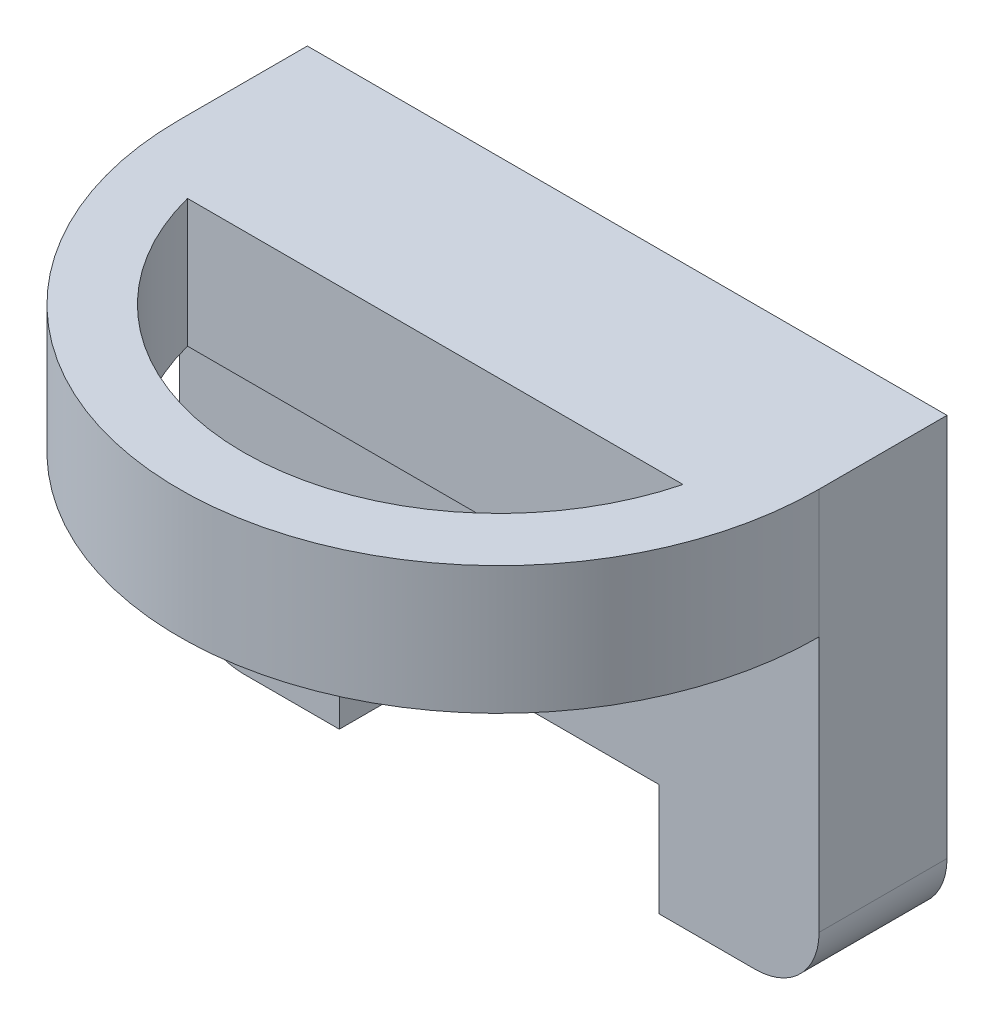
ISO-10303-21;
HEADER;
FILE_DESCRIPTION(('STEP AP214'),'2;1');
FILE_NAME('part.step','',(''),(''),'','','');
FILE_SCHEMA(('AUTOMOTIVE_DESIGN { 1 0 10303 214 1 1 1 1 }'));
ENDSEC;
DATA;
#1=APPLICATION_CONTEXT('core data for automotive mechanical design processes');
#2=APPLICATION_PROTOCOL_DEFINITION('international standard','automotive_design',2000,#1);
#3=PRODUCT_CONTEXT('',#1,'mechanical');
#4=PRODUCT('Part','Part','',(#3));
#5=PRODUCT_RELATED_PRODUCT_CATEGORY('part','',(#4));
#6=PRODUCT_DEFINITION_FORMATION('','',#4);
#7=PRODUCT_DEFINITION_CONTEXT('part definition',#1,'design');
#8=PRODUCT_DEFINITION('design','',#6,#7);
#9=PRODUCT_DEFINITION_SHAPE('','',#8);
#10=(LENGTH_UNIT() NAMED_UNIT(*) SI_UNIT(.MILLI.,.METRE.));
#11=(NAMED_UNIT(*) PLANE_ANGLE_UNIT() SI_UNIT($,.RADIAN.));
#12=(NAMED_UNIT(*) SI_UNIT($,.STERADIAN.) SOLID_ANGLE_UNIT());
#13=UNCERTAINTY_MEASURE_WITH_UNIT(LENGTH_MEASURE(1.E-05),#10,'distance_accuracy_value','');
#14=(GEOMETRIC_REPRESENTATION_CONTEXT(3) GLOBAL_UNCERTAINTY_ASSIGNED_CONTEXT((#13)) GLOBAL_UNIT_ASSIGNED_CONTEXT((#10,
#11,#12)) REPRESENTATION_CONTEXT('',''));
#15=CARTESIAN_POINT('',(0.,0.,0.));
#16=DIRECTION('',(0.,0.,1.));
#17=DIRECTION('',(1.,0.,0.));
#18=AXIS2_PLACEMENT_3D('',#15,#16,#17);
#19=CARTESIAN_POINT('',(-50.,35.,20.));
#20=DIRECTION('',(1.,0.,0.));
#21=DIRECTION('',(0.,1.,0.));
#22=AXIS2_PLACEMENT_3D('',#19,#20,#21);
#23=PLANE('',#22);
#24=DIRECTION('',(0.,-1.,0.));
#25=VECTOR('',#24,1.);
#26=CARTESIAN_POINT('',(-50.,35.,0.));
#27=LINE('',#26,#25);
#28=CARTESIAN_POINT('',(-50.,35.,0.));
#29=VERTEX_POINT('',#28);
#30=CARTESIAN_POINT('',(-50.,-24.9999999999999,0.));
#31=VERTEX_POINT('',#30);
#32=EDGE_CURVE('E161',#29,#31,#27,.T.);
#33=ORIENTED_EDGE('',*,*,#32,.T.);
#34=DIRECTION('',(0.,0.,-1.));
#35=VECTOR('',#34,1.);
#36=CARTESIAN_POINT('',(-50.,-24.9999999999999,20.));
#37=LINE('',#36,#35);
#38=CARTESIAN_POINT('',(-50.,-24.9999999999999,20.));
#39=VERTEX_POINT('',#38);
#40=EDGE_CURVE('E11',#39,#31,#37,.T.);
#41=ORIENTED_EDGE('',*,*,#40,.F.);
#42=DIRECTION('',(0.,-1.,0.));
#43=VECTOR('',#42,1.);
#44=CARTESIAN_POINT('',(-50.,35.,20.));
#45=LINE('',#44,#43);
#46=CARTESIAN_POINT('',(-50.,15.,20.));
#47=VERTEX_POINT('',#46);
#48=EDGE_CURVE('E166',#47,#39,#45,.T.);
#49=ORIENTED_EDGE('',*,*,#48,.F.);
#50=CARTESIAN_POINT('',(-50.,35.,20.));
#51=VERTEX_POINT('',#50);
#52=EDGE_CURVE('E162',#51,#47,#45,.T.);
#53=ORIENTED_EDGE('',*,*,#52,.F.);
#54=DIRECTION('',(0.,0.,-1.));
#55=VECTOR('',#54,1.);
#56=CARTESIAN_POINT('',(-50.,35.,20.));
#57=LINE('',#56,#55);
#58=EDGE_CURVE('E182',#51,#29,#57,.T.);
#59=ORIENTED_EDGE('',*,*,#58,.T.);
#60=EDGE_LOOP('',(#33,#41,#49,#53,#59));
#61=FACE_BOUND('',#60,.T.);
#62=ADVANCED_FACE('F33',(#61),#23,.F.);
#63=CARTESIAN_POINT('',(-40.,-25.,20.));
#64=DIRECTION('',(0.,0.,-1.));
#65=DIRECTION('',(-1.,0.,0.));
#66=AXIS2_PLACEMENT_3D('',#63,#64,#65);
#67=CYLINDRICAL_SURFACE('',#66,10.);
#68=CARTESIAN_POINT('',(-40.,-25.,0.));
#69=DIRECTION('',(0.,0.,1.));
#70=DIRECTION('',(1.,0.,0.));
#71=AXIS2_PLACEMENT_3D('',#68,#69,#70);
#72=CIRCLE('',#71,10.);
#73=CARTESIAN_POINT('',(-39.9999999999999,-35.,0.));
#74=VERTEX_POINT('',#73);
#75=EDGE_CURVE('E185',#31,#74,#72,.T.);
#76=ORIENTED_EDGE('',*,*,#75,.T.);
#77=DIRECTION('',(0.,0.,-1.));
#78=VECTOR('',#77,1.);
#79=CARTESIAN_POINT('',(-39.9999999999999,-35.,20.));
#80=LINE('',#79,#78);
#81=CARTESIAN_POINT('',(-39.9999999999999,-35.,20.));
#82=VERTEX_POINT('',#81);
#83=EDGE_CURVE('E40',#82,#74,#80,.T.);
#84=ORIENTED_EDGE('',*,*,#83,.F.);
#85=CARTESIAN_POINT('',(-40.,-25.,20.));
#86=DIRECTION('',(0.,0.,1.));
#87=DIRECTION('',(1.,0.,0.));
#88=AXIS2_PLACEMENT_3D('',#85,#86,#87);
#89=CIRCLE('',#88,10.);
#90=EDGE_CURVE('E165',#39,#82,#89,.T.);
#91=ORIENTED_EDGE('',*,*,#90,.F.);
#92=ORIENTED_EDGE('',*,*,#40,.T.);
#93=EDGE_LOOP('',(#76,#84,#91,#92));
#94=FACE_BOUND('',#93,.T.);
#95=ADVANCED_FACE('F252',(#94),#67,.T.);
#96=CARTESIAN_POINT('',(-39.9999999999999,-35.,20.));
#97=DIRECTION('',(0.,1.,0.));
#98=DIRECTION('',(0.,0.,1.));
#99=AXIS2_PLACEMENT_3D('',#96,#97,#98);
#100=PLANE('',#99);
#101=DIRECTION('',(1.,0.,0.));
#102=VECTOR('',#101,1.);
#103=CARTESIAN_POINT('',(-39.9999999999999,-35.,0.));
#104=LINE('',#103,#102);
#105=CARTESIAN_POINT('',(-25.,-35.,0.));
#106=VERTEX_POINT('',#105);
#107=EDGE_CURVE('E187',#74,#106,#104,.T.);
#108=ORIENTED_EDGE('',*,*,#107,.T.);
#109=DIRECTION('',(0.,0.,-1.));
#110=VECTOR('',#109,1.);
#111=CARTESIAN_POINT('',(-25.,-35.,20.));
#112=LINE('',#111,#110);
#113=CARTESIAN_POINT('',(-25.,-35.,20.));
#114=VERTEX_POINT('',#113);
#115=EDGE_CURVE('E223',#114,#106,#112,.T.);
#116=ORIENTED_EDGE('',*,*,#115,.F.);
#117=DIRECTION('',(1.,0.,0.));
#118=VECTOR('',#117,1.);
#119=CARTESIAN_POINT('',(-39.9999999999999,-35.,20.));
#120=LINE('',#119,#118);
#121=EDGE_CURVE('E168',#82,#114,#120,.T.);
#122=ORIENTED_EDGE('',*,*,#121,.F.);
#123=ORIENTED_EDGE('',*,*,#83,.T.);
#124=EDGE_LOOP('',(#108,#116,#122,#123));
#125=FACE_BOUND('',#124,.T.);
#126=ADVANCED_FACE('F230',(#125),#100,.F.);
#127=CARTESIAN_POINT('',(-25.,-35.,20.));
#128=DIRECTION('',(-1.,0.,0.));
#129=DIRECTION('',(0.,0.,1.));
#130=AXIS2_PLACEMENT_3D('',#127,#128,#129);
#131=PLANE('',#130);
#132=DIRECTION('',(0.,1.,0.));
#133=VECTOR('',#132,1.);
#134=CARTESIAN_POINT('',(-25.,-35.,0.));
#135=LINE('',#134,#133);
#136=CARTESIAN_POINT('',(-25.,-17.5,0.));
#137=VERTEX_POINT('',#136);
#138=EDGE_CURVE('E189',#106,#137,#135,.T.);
#139=ORIENTED_EDGE('',*,*,#138,.T.);
#140=DIRECTION('',(0.,0.,-1.));
#141=VECTOR('',#140,1.);
#142=CARTESIAN_POINT('',(-25.,-17.5,20.));
#143=LINE('',#142,#141);
#144=CARTESIAN_POINT('',(-25.,-17.5,20.));
#145=VERTEX_POINT('',#144);
#146=EDGE_CURVE('E220',#145,#137,#143,.T.);
#147=ORIENTED_EDGE('',*,*,#146,.F.);
#148=DIRECTION('',(0.,1.,0.));
#149=VECTOR('',#148,1.);
#150=CARTESIAN_POINT('',(-25.,-35.,20.));
#151=LINE('',#150,#149);
#152=EDGE_CURVE('E170',#114,#145,#151,.T.);
#153=ORIENTED_EDGE('',*,*,#152,.F.);
#154=ORIENTED_EDGE('',*,*,#115,.T.);
#155=EDGE_LOOP('',(#139,#147,#153,#154));
#156=FACE_BOUND('',#155,.T.);
#157=ADVANCED_FACE('F242',(#156),#131,.F.);
#158=CARTESIAN_POINT('',(-25.,-17.5,20.));
#159=DIRECTION('',(0.,1.,0.));
#160=DIRECTION('',(0.,0.,1.));
#161=AXIS2_PLACEMENT_3D('',#158,#159,#160);
#162=PLANE('',#161);
#163=DIRECTION('',(1.,0.,0.));
#164=VECTOR('',#163,1.);
#165=CARTESIAN_POINT('',(-25.,-17.5,0.));
#166=LINE('',#165,#164);
#167=CARTESIAN_POINT('',(25.,-17.5,0.));
#168=VERTEX_POINT('',#167);
#169=EDGE_CURVE('E191',#137,#168,#166,.T.);
#170=ORIENTED_EDGE('',*,*,#169,.T.);
#171=DIRECTION('',(0.,0.,-1.));
#172=VECTOR('',#171,1.);
#173=CARTESIAN_POINT('',(25.,-17.5,20.));
#174=LINE('',#173,#172);
#175=CARTESIAN_POINT('',(25.,-17.5,20.));
#176=VERTEX_POINT('',#175);
#177=EDGE_CURVE('E217',#176,#168,#174,.T.);
#178=ORIENTED_EDGE('',*,*,#177,.F.);
#179=DIRECTION('',(1.,0.,0.));
#180=VECTOR('',#179,1.);
#181=CARTESIAN_POINT('',(-25.,-17.5,20.));
#182=LINE('',#181,#180);
#183=EDGE_CURVE('E172',#145,#176,#182,.T.);
#184=ORIENTED_EDGE('',*,*,#183,.F.);
#185=ORIENTED_EDGE('',*,*,#146,.T.);
#186=EDGE_LOOP('',(#170,#178,#184,#185));
#187=FACE_BOUND('',#186,.T.);
#188=ADVANCED_FACE('F246',(#187),#162,.F.);
#189=CARTESIAN_POINT('',(25.,-35.,20.));
#190=DIRECTION('',(1.,0.,0.));
#191=DIRECTION('',(0.,1.,0.));
#192=AXIS2_PLACEMENT_3D('',#189,#190,#191);
#193=PLANE('',#192);
#194=DIRECTION('',(0.,-1.,0.));
#195=VECTOR('',#194,1.);
#196=CARTESIAN_POINT('',(25.,-35.,0.));
#197=LINE('',#196,#195);
#198=CARTESIAN_POINT('',(25.,-35.,0.));
#199=VERTEX_POINT('',#198);
#200=EDGE_CURVE('E193',#168,#199,#197,.T.);
#201=ORIENTED_EDGE('',*,*,#200,.T.);
#202=DIRECTION('',(0.,0.,-1.));
#203=VECTOR('',#202,1.);
#204=CARTESIAN_POINT('',(25.,-35.,20.));
#205=LINE('',#204,#203);
#206=CARTESIAN_POINT('',(25.,-35.,20.));
#207=VERTEX_POINT('',#206);
#208=EDGE_CURVE('E214',#207,#199,#205,.T.);
#209=ORIENTED_EDGE('',*,*,#208,.F.);
#210=DIRECTION('',(0.,-1.,0.));
#211=VECTOR('',#210,1.);
#212=CARTESIAN_POINT('',(25.,-35.,20.));
#213=LINE('',#212,#211);
#214=EDGE_CURVE('E174',#176,#207,#213,.T.);
#215=ORIENTED_EDGE('',*,*,#214,.F.);
#216=ORIENTED_EDGE('',*,*,#177,.T.);
#217=EDGE_LOOP('',(#201,#209,#215,#216));
#218=FACE_BOUND('',#217,.T.);
#219=ADVANCED_FACE('F287',(#218),#193,.F.);
#220=CARTESIAN_POINT('',(25.,-35.,20.));
#221=DIRECTION('',(0.,1.,0.));
#222=DIRECTION('',(0.,0.,1.));
#223=AXIS2_PLACEMENT_3D('',#220,#221,#222);
#224=PLANE('',#223);
#225=DIRECTION('',(1.,0.,0.));
#226=VECTOR('',#225,1.);
#227=CARTESIAN_POINT('',(25.,-35.,0.));
#228=LINE('',#227,#226);
#229=CARTESIAN_POINT('',(39.9999999999999,-35.,0.));
#230=VERTEX_POINT('',#229);
#231=EDGE_CURVE('E195',#199,#230,#228,.T.);
#232=ORIENTED_EDGE('',*,*,#231,.T.);
#233=DIRECTION('',(0.,0.,-1.));
#234=VECTOR('',#233,1.);
#235=CARTESIAN_POINT('',(39.9999999999999,-35.,20.));
#236=LINE('',#235,#234);
#237=CARTESIAN_POINT('',(39.9999999999999,-35.,20.));
#238=VERTEX_POINT('',#237);
#239=EDGE_CURVE('E211',#238,#230,#236,.T.);
#240=ORIENTED_EDGE('',*,*,#239,.F.);
#241=DIRECTION('',(1.,0.,0.));
#242=VECTOR('',#241,1.);
#243=CARTESIAN_POINT('',(25.,-35.,20.));
#244=LINE('',#243,#242);
#245=EDGE_CURVE('E176',#207,#238,#244,.T.);
#246=ORIENTED_EDGE('',*,*,#245,.F.);
#247=ORIENTED_EDGE('',*,*,#208,.T.);
#248=EDGE_LOOP('',(#232,#240,#246,#247));
#249=FACE_BOUND('',#248,.T.);
#250=ADVANCED_FACE('F290',(#249),#224,.F.);
#251=CARTESIAN_POINT('',(40.,-25.,20.));
#252=DIRECTION('',(0.,0.,-1.));
#253=DIRECTION('',(-1.,0.,0.));
#254=AXIS2_PLACEMENT_3D('',#251,#252,#253);
#255=CYLINDRICAL_SURFACE('',#254,10.);
#256=CARTESIAN_POINT('',(40.,-25.,0.));
#257=DIRECTION('',(0.,0.,1.));
#258=DIRECTION('',(1.,0.,0.));
#259=AXIS2_PLACEMENT_3D('',#256,#257,#258);
#260=CIRCLE('',#259,10.);
#261=CARTESIAN_POINT('',(50.,-24.9999999999999,0.));
#262=VERTEX_POINT('',#261);
#263=EDGE_CURVE('E197',#230,#262,#260,.T.);
#264=ORIENTED_EDGE('',*,*,#263,.T.);
#265=DIRECTION('',(0.,0.,-1.));
#266=VECTOR('',#265,1.);
#267=CARTESIAN_POINT('',(50.,-24.9999999999999,20.));
#268=LINE('',#267,#266);
#269=CARTESIAN_POINT('',(50.,-24.9999999999999,20.));
#270=VERTEX_POINT('',#269);
#271=EDGE_CURVE('E208',#270,#262,#268,.T.);
#272=ORIENTED_EDGE('',*,*,#271,.F.);
#273=CARTESIAN_POINT('',(40.,-25.,20.));
#274=DIRECTION('',(0.,0.,1.));
#275=DIRECTION('',(1.,0.,0.));
#276=AXIS2_PLACEMENT_3D('',#273,#274,#275);
#277=CIRCLE('',#276,10.);
#278=EDGE_CURVE('E178',#238,#270,#277,.T.);
#279=ORIENTED_EDGE('',*,*,#278,.F.);
#280=ORIENTED_EDGE('',*,*,#239,.T.);
#281=EDGE_LOOP('',(#264,#272,#279,#280));
#282=FACE_BOUND('',#281,.T.);
#283=ADVANCED_FACE('F294',(#282),#255,.T.);
#284=CARTESIAN_POINT('',(50.,35.,20.));
#285=DIRECTION('',(-1.,0.,0.));
#286=DIRECTION('',(0.,-1.,0.));
#287=AXIS2_PLACEMENT_3D('',#284,#285,#286);
#288=PLANE('',#287);
#289=DIRECTION('',(0.,1.,0.));
#290=VECTOR('',#289,1.);
#291=CARTESIAN_POINT('',(50.,35.,0.));
#292=LINE('',#291,#290);
#293=CARTESIAN_POINT('',(50.,35.,0.));
#294=VERTEX_POINT('',#293);
#295=EDGE_CURVE('E199',#262,#294,#292,.T.);
#296=ORIENTED_EDGE('',*,*,#295,.T.);
#297=DIRECTION('',(0.,0.,-1.));
#298=VECTOR('',#297,1.);
#299=CARTESIAN_POINT('',(50.,35.,20.));
#300=LINE('',#299,#298);
#301=CARTESIAN_POINT('',(50.,35.,20.));
#302=VERTEX_POINT('',#301);
#303=EDGE_CURVE('E205',#302,#294,#300,.T.);
#304=ORIENTED_EDGE('',*,*,#303,.F.);
#305=DIRECTION('',(0.,1.,0.));
#306=VECTOR('',#305,1.);
#307=CARTESIAN_POINT('',(50.,15.,20.));
#308=LINE('',#307,#306);
#309=CARTESIAN_POINT('',(50.,15.,20.));
#310=VERTEX_POINT('',#309);
#311=EDGE_CURVE('E47',#310,#302,#308,.T.);
#312=ORIENTED_EDGE('',*,*,#311,.F.);
#313=DIRECTION('',(0.,1.,0.));
#314=VECTOR('',#313,1.);
#315=CARTESIAN_POINT('',(50.,35.,20.));
#316=LINE('',#315,#314);
#317=EDGE_CURVE('E180',#270,#310,#316,.T.);
#318=ORIENTED_EDGE('',*,*,#317,.F.);
#319=ORIENTED_EDGE('',*,*,#271,.T.);
#320=EDGE_LOOP('',(#296,#304,#312,#318,#319));
#321=FACE_BOUND('',#320,.T.);
#322=ADVANCED_FACE('F262',(#321),#288,.F.);
#323=CARTESIAN_POINT('',(-50.,35.,20.));
#324=DIRECTION('',(0.,-1.,0.));
#325=DIRECTION('',(0.,0.,-1.));
#326=AXIS2_PLACEMENT_3D('',#323,#324,#325);
#327=PLANE('',#326);
#328=DIRECTION('',(-1.,0.,0.));
#329=VECTOR('',#328,1.);
#330=CARTESIAN_POINT('',(-50.,35.,0.));
#331=LINE('',#330,#329);
#332=EDGE_CURVE('E201',#294,#29,#331,.T.);
#333=ORIENTED_EDGE('',*,*,#332,.T.);
#334=ORIENTED_EDGE('',*,*,#58,.F.);
#335=CARTESIAN_POINT('',(0.,35.,20.));
#336=DIRECTION('',(0.,1.,0.));
#337=DIRECTION('',(0.,0.,-1.));
#338=AXIS2_PLACEMENT_3D('',#335,#336,#337);
#339=CIRCLE('',#338,50.);
#340=EDGE_CURVE('E152',#51,#302,#339,.T.);
#341=ORIENTED_EDGE('',*,*,#340,.T.);
#342=ORIENTED_EDGE('',*,*,#303,.T.);
#343=EDGE_LOOP('',(#333,#334,#341,#342));
#344=FACE_BOUND('',#343,.T.);
#345=DIRECTION('',(-1.,0.,0.));
#346=VECTOR('',#345,1.);
#347=CARTESIAN_POINT('',(-38.7298334620742,35.,30.));
#348=LINE('',#347,#346);
#349=CARTESIAN_POINT('',(38.7298334620742,35.,30.));
#350=VERTEX_POINT('',#349);
#351=CARTESIAN_POINT('',(-38.7298334620742,35.,30.));
#352=VERTEX_POINT('',#351);
#353=EDGE_CURVE('E147',#350,#352,#348,.T.);
#354=ORIENTED_EDGE('',*,*,#353,.F.);
#355=CARTESIAN_POINT('',(0.,35.,20.));
#356=DIRECTION('',(0.,1.,0.));
#357=DIRECTION('',(0.,0.,-1.));
#358=AXIS2_PLACEMENT_3D('',#355,#356,#357);
#359=CIRCLE('',#358,40.);
#360=EDGE_CURVE('E134',#352,#350,#359,.T.);
#361=ORIENTED_EDGE('',*,*,#360,.F.);
#362=EDGE_LOOP('',(#354,#361));
#363=FACE_BOUND('',#362,.T.);
#364=ADVANCED_FACE('F259',(#344,#363),#327,.F.);
#365=CARTESIAN_POINT('',(-40.,-25.,20.));
#366=DIRECTION('',(0.,0.,1.));
#367=DIRECTION('',(1.,0.,0.));
#368=AXIS2_PLACEMENT_3D('',#365,#366,#367);
#369=PLANE('',#368);
#370=DIRECTION('',(-1.,0.,0.));
#371=VECTOR('',#370,1.);
#372=CARTESIAN_POINT('',(50.,15.,20.));
#373=LINE('',#372,#371);
#374=EDGE_CURVE('E54',#310,#47,#373,.T.);
#375=ORIENTED_EDGE('',*,*,#374,.T.);
#376=ORIENTED_EDGE('',*,*,#48,.T.);
#377=ORIENTED_EDGE('',*,*,#90,.T.);
#378=ORIENTED_EDGE('',*,*,#121,.T.);
#379=ORIENTED_EDGE('',*,*,#152,.T.);
#380=ORIENTED_EDGE('',*,*,#183,.T.);
#381=ORIENTED_EDGE('',*,*,#214,.T.);
#382=ORIENTED_EDGE('',*,*,#245,.T.);
#383=ORIENTED_EDGE('',*,*,#278,.T.);
#384=ORIENTED_EDGE('',*,*,#317,.T.);
#385=EDGE_LOOP('',(#375,#376,#377,#378,#379,#380,#381,#382,#383,#384));
#386=FACE_BOUND('',#385,.T.);
#387=ADVANCED_FACE('F249',(#386),#369,.T.);
#388=CARTESIAN_POINT('',(-40.,-25.,0.));
#389=DIRECTION('',(0.,0.,1.));
#390=DIRECTION('',(1.,0.,0.));
#391=AXIS2_PLACEMENT_3D('',#388,#389,#390);
#392=PLANE('',#391);
#393=ORIENTED_EDGE('',*,*,#32,.F.);
#394=ORIENTED_EDGE('',*,*,#332,.F.);
#395=ORIENTED_EDGE('',*,*,#295,.F.);
#396=ORIENTED_EDGE('',*,*,#263,.F.);
#397=ORIENTED_EDGE('',*,*,#231,.F.);
#398=ORIENTED_EDGE('',*,*,#200,.F.);
#399=ORIENTED_EDGE('',*,*,#169,.F.);
#400=ORIENTED_EDGE('',*,*,#138,.F.);
#401=ORIENTED_EDGE('',*,*,#107,.F.);
#402=ORIENTED_EDGE('',*,*,#75,.F.);
#403=EDGE_LOOP('',(#393,#394,#395,#396,#397,#398,#399,#400,#401,#402));
#404=FACE_BOUND('',#403,.T.);
#405=ADVANCED_FACE('F237',(#404),#392,.F.);
#406=CARTESIAN_POINT('',(0.,15.,20.));
#407=DIRECTION('',(0.,1.,0.));
#408=DIRECTION('',(0.,0.,1.));
#409=AXIS2_PLACEMENT_3D('',#406,#407,#408);
#410=CYLINDRICAL_SURFACE('',#409,50.);
#411=ORIENTED_EDGE('',*,*,#340,.F.);
#412=ORIENTED_EDGE('',*,*,#52,.T.);
#413=CARTESIAN_POINT('',(0.,15.,20.));
#414=DIRECTION('',(0.,1.,0.));
#415=DIRECTION('',(0.,0.,-1.));
#416=AXIS2_PLACEMENT_3D('',#413,#414,#415);
#417=CIRCLE('',#416,50.);
#418=EDGE_CURVE('E154',#47,#310,#417,.T.);
#419=ORIENTED_EDGE('',*,*,#418,.T.);
#420=ORIENTED_EDGE('',*,*,#311,.T.);
#421=EDGE_LOOP('',(#411,#412,#419,#420));
#422=FACE_BOUND('',#421,.T.);
#423=ADVANCED_FACE('F264',(#422),#410,.T.);
#424=CARTESIAN_POINT('',(0.,15.,20.));
#425=DIRECTION('',(0.,-1.,0.));
#426=DIRECTION('',(0.,0.,-1.));
#427=AXIS2_PLACEMENT_3D('',#424,#425,#426);
#428=PLANE('',#427);
#429=CARTESIAN_POINT('',(0.,15.,20.));
#430=DIRECTION('',(0.,1.,0.));
#431=DIRECTION('',(0.,0.,-1.));
#432=AXIS2_PLACEMENT_3D('',#429,#430,#431);
#433=CIRCLE('',#432,40.);
#434=CARTESIAN_POINT('',(-38.7298334620742,15.,30.));
#435=VERTEX_POINT('',#434);
#436=CARTESIAN_POINT('',(38.7298334620742,15.,30.));
#437=VERTEX_POINT('',#436);
#438=EDGE_CURVE('E131',#435,#437,#433,.T.);
#439=ORIENTED_EDGE('',*,*,#438,.T.);
#440=DIRECTION('',(-1.,0.,0.));
#441=VECTOR('',#440,1.);
#442=CARTESIAN_POINT('',(-38.7298334620742,15.,30.));
#443=LINE('',#442,#441);
#444=EDGE_CURVE('E139',#437,#435,#443,.T.);
#445=ORIENTED_EDGE('',*,*,#444,.T.);
#446=EDGE_LOOP('',(#439,#445));
#447=FACE_BOUND('',#446,.T.);
#448=ORIENTED_EDGE('',*,*,#418,.F.);
#449=ORIENTED_EDGE('',*,*,#374,.F.);
#450=EDGE_LOOP('',(#448,#449));
#451=FACE_BOUND('',#450,.T.);
#452=ADVANCED_FACE('F145',(#447,#451),#428,.T.);
#453=CARTESIAN_POINT('',(0.,15.,20.));
#454=DIRECTION('',(0.,1.,0.));
#455=DIRECTION('',(0.,0.,1.));
#456=AXIS2_PLACEMENT_3D('',#453,#454,#455);
#457=CYLINDRICAL_SURFACE('',#456,40.);
#458=ORIENTED_EDGE('',*,*,#360,.T.);
#459=DIRECTION('',(0.,1.,0.));
#460=VECTOR('',#459,1.);
#461=CARTESIAN_POINT('',(38.7298334620742,15.,30.));
#462=LINE('',#461,#460);
#463=EDGE_CURVE('E127',#437,#350,#462,.T.);
#464=ORIENTED_EDGE('',*,*,#463,.F.);
#465=ORIENTED_EDGE('',*,*,#438,.F.);
#466=DIRECTION('',(0.,1.,0.));
#467=VECTOR('',#466,1.);
#468=CARTESIAN_POINT('',(-38.7298334620742,15.,30.));
#469=LINE('',#468,#467);
#470=EDGE_CURVE('E138',#435,#352,#469,.T.);
#471=ORIENTED_EDGE('',*,*,#470,.T.);
#472=EDGE_LOOP('',(#458,#464,#465,#471));
#473=FACE_BOUND('',#472,.T.);
#474=ADVANCED_FACE('F129',(#473),#457,.F.);
#475=CARTESIAN_POINT('',(-38.7298334620742,15.,30.));
#476=DIRECTION('',(0.,0.,-1.));
#477=DIRECTION('',(-1.,0.,0.));
#478=AXIS2_PLACEMENT_3D('',#475,#476,#477);
#479=PLANE('',#478);
#480=ORIENTED_EDGE('',*,*,#353,.T.);
#481=ORIENTED_EDGE('',*,*,#470,.F.);
#482=ORIENTED_EDGE('',*,*,#444,.F.);
#483=ORIENTED_EDGE('',*,*,#463,.T.);
#484=EDGE_LOOP('',(#480,#481,#482,#483));
#485=FACE_BOUND('',#484,.T.);
#486=ADVANCED_FACE('F142',(#485),#479,.F.);
#487=CLOSED_SHELL('',(#62,#95,#126,#157,#188,#219,#250,#283,#322,#364,#387,#405,#423,#452,#474,#486));
#488=MANIFOLD_SOLID_BREP('B2',#487);
#489=ADVANCED_BREP_SHAPE_REPRESENTATION('',(#18,#488),#14);
#490=SHAPE_DEFINITION_REPRESENTATION(#9,#489);
ENDSEC;
END-ISO-10303-21;
